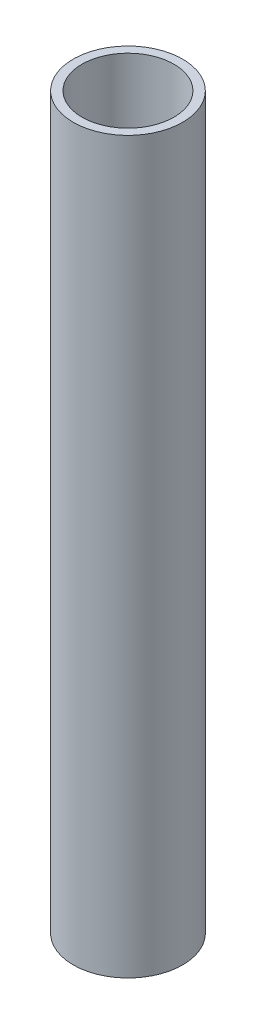
ISO-10303-21;
HEADER;
FILE_DESCRIPTION(('STEP AP214'),'2;1');
FILE_NAME('part.step','',(''),(''),'','','');
FILE_SCHEMA(('AUTOMOTIVE_DESIGN { 1 0 10303 214 1 1 1 1 }'));
ENDSEC;
DATA;
#1=APPLICATION_CONTEXT('core data for automotive mechanical design processes');
#2=APPLICATION_PROTOCOL_DEFINITION('international standard','automotive_design',2000,#1);
#3=PRODUCT_CONTEXT('',#1,'mechanical');
#4=PRODUCT('Part','Part','',(#3));
#5=PRODUCT_RELATED_PRODUCT_CATEGORY('part','',(#4));
#6=PRODUCT_DEFINITION_FORMATION('','',#4);
#7=PRODUCT_DEFINITION_CONTEXT('part definition',#1,'design');
#8=PRODUCT_DEFINITION('design','',#6,#7);
#9=PRODUCT_DEFINITION_SHAPE('','',#8);
#10=(LENGTH_UNIT() NAMED_UNIT(*) SI_UNIT(.MILLI.,.METRE.));
#11=(NAMED_UNIT(*) PLANE_ANGLE_UNIT() SI_UNIT($,.RADIAN.));
#12=(NAMED_UNIT(*) SI_UNIT($,.STERADIAN.) SOLID_ANGLE_UNIT());
#13=UNCERTAINTY_MEASURE_WITH_UNIT(LENGTH_MEASURE(1.E-05),#10,'distance_accuracy_value','');
#14=(GEOMETRIC_REPRESENTATION_CONTEXT(3) GLOBAL_UNCERTAINTY_ASSIGNED_CONTEXT((#13)) GLOBAL_UNIT_ASSIGNED_CONTEXT((#10,
#11,#12)) REPRESENTATION_CONTEXT('',''));
#15=CARTESIAN_POINT('',(0.,0.,0.));
#16=DIRECTION('',(0.,0.,1.));
#17=DIRECTION('',(1.,0.,0.));
#18=AXIS2_PLACEMENT_3D('',#15,#16,#17);
#19=CARTESIAN_POINT('',(0.,127.,0.));
#20=DIRECTION('',(0.,-1.,0.));
#21=DIRECTION('',(0.,0.,-1.));
#22=AXIS2_PLACEMENT_3D('',#19,#20,#21);
#23=CYLINDRICAL_SURFACE('',#22,9.525);
#24=CARTESIAN_POINT('',(0.,127.,0.));
#25=DIRECTION('',(0.,1.,0.));
#26=DIRECTION('',(0.,0.,1.));
#27=AXIS2_PLACEMENT_3D('',#24,#25,#26);
#28=CIRCLE('',#27,9.525);
#29=CARTESIAN_POINT('',(0.,127.,9.525));
#30=VERTEX_POINT('',#29);
#31=EDGE_CURVE('E10',#30,#30,#28,.T.);
#32=ORIENTED_EDGE('',*,*,#31,.F.);
#33=EDGE_LOOP('',(#32));
#34=FACE_BOUND('',#33,.T.);
#35=CARTESIAN_POINT('',(0.,0.,0.));
#36=DIRECTION('',(0.,1.,0.));
#37=DIRECTION('',(0.,0.,1.));
#38=AXIS2_PLACEMENT_3D('',#35,#36,#37);
#39=CIRCLE('',#38,9.525);
#40=CARTESIAN_POINT('',(0.,0.,9.525));
#41=VERTEX_POINT('',#40);
#42=EDGE_CURVE('E37',#41,#41,#39,.T.);
#43=ORIENTED_EDGE('',*,*,#42,.T.);
#44=EDGE_LOOP('',(#43));
#45=FACE_BOUND('',#44,.T.);
#46=ADVANCED_FACE('F34',(#34,#45),#23,.T.);
#47=CARTESIAN_POINT('',(0.,127.,0.));
#48=DIRECTION('',(0.,1.,0.));
#49=DIRECTION('',(0.,0.,1.));
#50=AXIS2_PLACEMENT_3D('',#47,#48,#49);
#51=PLANE('',#50);
#52=CARTESIAN_POINT('',(0.,127.,0.));
#53=DIRECTION('',(0.,1.,0.));
#54=DIRECTION('',(0.,0.,1.));
#55=AXIS2_PLACEMENT_3D('',#52,#53,#54);
#56=CIRCLE('',#55,8.001);
#57=CARTESIAN_POINT('',(0.,127.,8.001));
#58=VERTEX_POINT('',#57);
#59=EDGE_CURVE('E46',#58,#58,#56,.T.);
#60=ORIENTED_EDGE('',*,*,#59,.F.);
#61=EDGE_LOOP('',(#60));
#62=FACE_BOUND('',#61,.T.);
#63=ORIENTED_EDGE('',*,*,#31,.T.);
#64=EDGE_LOOP('',(#63));
#65=FACE_BOUND('',#64,.T.);
#66=ADVANCED_FACE('F61',(#62,#65),#51,.T.);
#67=CARTESIAN_POINT('',(0.,0.,0.));
#68=DIRECTION('',(0.,1.,0.));
#69=DIRECTION('',(0.,0.,1.));
#70=AXIS2_PLACEMENT_3D('',#67,#68,#69);
#71=PLANE('',#70);
#72=CARTESIAN_POINT('',(0.,0.,0.));
#73=DIRECTION('',(0.,1.,0.));
#74=DIRECTION('',(0.,0.,1.));
#75=AXIS2_PLACEMENT_3D('',#72,#73,#74);
#76=CIRCLE('',#75,8.001);
#77=CARTESIAN_POINT('',(0.,0.,8.001));
#78=VERTEX_POINT('',#77);
#79=EDGE_CURVE('E44',#78,#78,#76,.T.);
#80=ORIENTED_EDGE('',*,*,#79,.T.);
#81=EDGE_LOOP('',(#80));
#82=FACE_BOUND('',#81,.T.);
#83=ORIENTED_EDGE('',*,*,#42,.F.);
#84=EDGE_LOOP('',(#83));
#85=FACE_BOUND('',#84,.T.);
#86=ADVANCED_FACE('F52',(#82,#85),#71,.F.);
#87=CARTESIAN_POINT('',(0.,0.,0.));
#88=DIRECTION('',(0.,1.,0.));
#89=DIRECTION('',(0.,0.,1.));
#90=AXIS2_PLACEMENT_3D('',#87,#88,#89);
#91=CYLINDRICAL_SURFACE('',#90,8.001);
#92=ORIENTED_EDGE('',*,*,#79,.F.);
#93=EDGE_LOOP('',(#92));
#94=FACE_BOUND('',#93,.T.);
#95=ORIENTED_EDGE('',*,*,#59,.T.);
#96=EDGE_LOOP('',(#95));
#97=FACE_BOUND('',#96,.T.);
#98=ADVANCED_FACE('F55',(#94,#97),#91,.F.);
#99=CLOSED_SHELL('',(#46,#66,#86,#98));
#100=MANIFOLD_SOLID_BREP('B2',#99);
#101=ADVANCED_BREP_SHAPE_REPRESENTATION('',(#18,#100),#14);
#102=SHAPE_DEFINITION_REPRESENTATION(#9,#101);
ENDSEC;
END-ISO-10303-21;
